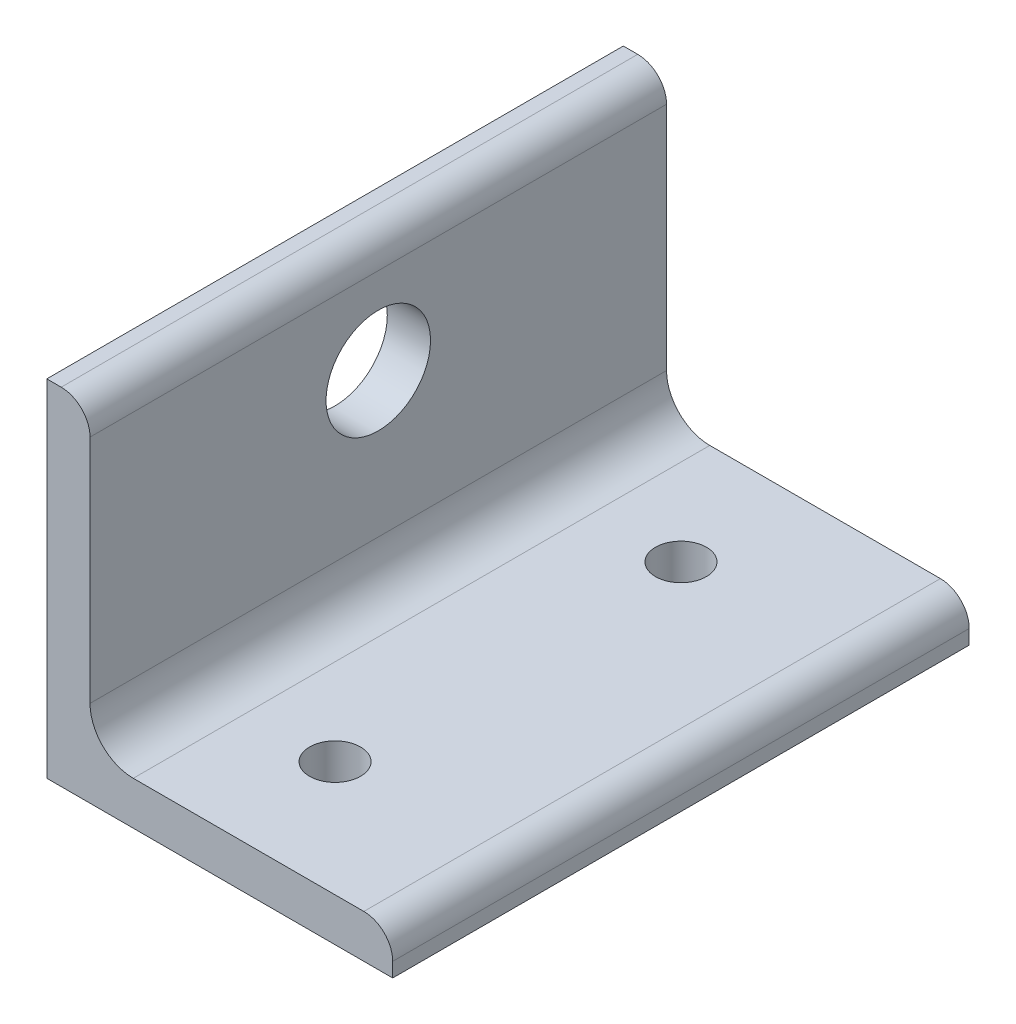
ISO-10303-21;
HEADER;
FILE_DESCRIPTION(('STEP AP214'),'2;1');
FILE_NAME('part.step','',(''),(''),'','','');
FILE_SCHEMA(('AUTOMOTIVE_DESIGN { 1 0 10303 214 1 1 1 1 }'));
ENDSEC;
DATA;
#1=APPLICATION_CONTEXT('core data for automotive mechanical design processes');
#2=APPLICATION_PROTOCOL_DEFINITION('international standard','automotive_design',2000,#1);
#3=PRODUCT_CONTEXT('',#1,'mechanical');
#4=PRODUCT('Part','Part','',(#3));
#5=PRODUCT_RELATED_PRODUCT_CATEGORY('part','',(#4));
#6=PRODUCT_DEFINITION_FORMATION('','',#4);
#7=PRODUCT_DEFINITION_CONTEXT('part definition',#1,'design');
#8=PRODUCT_DEFINITION('design','',#6,#7);
#9=PRODUCT_DEFINITION_SHAPE('','',#8);
#10=(LENGTH_UNIT() NAMED_UNIT(*) SI_UNIT(.MILLI.,.METRE.));
#11=(NAMED_UNIT(*) PLANE_ANGLE_UNIT() SI_UNIT($,.RADIAN.));
#12=(NAMED_UNIT(*) SI_UNIT($,.STERADIAN.) SOLID_ANGLE_UNIT());
#13=UNCERTAINTY_MEASURE_WITH_UNIT(LENGTH_MEASURE(1.E-05),#10,'distance_accuracy_value','');
#14=(GEOMETRIC_REPRESENTATION_CONTEXT(3) GLOBAL_UNCERTAINTY_ASSIGNED_CONTEXT((#13)) GLOBAL_UNIT_ASSIGNED_CONTEXT((#10,
#11,#12)) REPRESENTATION_CONTEXT('',''));
#15=CARTESIAN_POINT('',(0.,0.,0.));
#16=DIRECTION('',(0.,0.,1.));
#17=DIRECTION('',(1.,0.,0.));
#18=AXIS2_PLACEMENT_3D('',#15,#16,#17);
#19=CARTESIAN_POINT('',(0.,0.,63.5));
#20=DIRECTION('',(0.,1.,0.));
#21=DIRECTION('',(0.,0.,1.));
#22=AXIS2_PLACEMENT_3D('',#19,#20,#21);
#23=PLANE('',#22);
#24=CARTESIAN_POINT('',(19.05,0.,50.8));
#25=DIRECTION('',(0.,1.,0.));
#26=DIRECTION('',(0.,0.,1.));
#27=AXIS2_PLACEMENT_3D('',#24,#25,#26);
#28=CIRCLE('',#27,2.80669999999999);
#29=CARTESIAN_POINT('',(19.05,0.,53.6067));
#30=VERTEX_POINT('',#29);
#31=EDGE_CURVE('E197',#30,#30,#28,.T.);
#32=ORIENTED_EDGE('',*,*,#31,.T.);
#33=EDGE_LOOP('',(#32));
#34=FACE_BOUND('',#33,.T.);
#35=CARTESIAN_POINT('',(19.05,0.,12.7));
#36=DIRECTION('',(0.,1.,0.));
#37=DIRECTION('',(0.,0.,1.));
#38=AXIS2_PLACEMENT_3D('',#35,#36,#37);
#39=CIRCLE('',#38,2.80669999999999);
#40=CARTESIAN_POINT('',(19.05,0.,15.5067));
#41=VERTEX_POINT('',#40);
#42=EDGE_CURVE('E138',#41,#41,#39,.T.);
#43=ORIENTED_EDGE('',*,*,#42,.T.);
#44=EDGE_LOOP('',(#43));
#45=FACE_BOUND('',#44,.T.);
#46=DIRECTION('',(1.,0.,0.));
#47=VECTOR('',#46,1.);
#48=CARTESIAN_POINT('',(0.,0.,0.));
#49=LINE('',#48,#47);
#50=CARTESIAN_POINT('',(0.,0.,0.));
#51=VERTEX_POINT('',#50);
#52=CARTESIAN_POINT('',(38.1,0.,0.));
#53=VERTEX_POINT('',#52);
#54=EDGE_CURVE('E134',#51,#53,#49,.T.);
#55=ORIENTED_EDGE('',*,*,#54,.T.);
#56=DIRECTION('',(0.,0.,-1.));
#57=VECTOR('',#56,1.);
#58=CARTESIAN_POINT('',(38.1,0.,63.5));
#59=LINE('',#58,#57);
#60=CARTESIAN_POINT('',(38.1,0.,63.5));
#61=VERTEX_POINT('',#60);
#62=EDGE_CURVE('E11',#61,#53,#59,.T.);
#63=ORIENTED_EDGE('',*,*,#62,.F.);
#64=DIRECTION('',(1.,0.,0.));
#65=VECTOR('',#64,1.);
#66=CARTESIAN_POINT('',(0.,0.,63.5));
#67=LINE('',#66,#65);
#68=CARTESIAN_POINT('',(0.,0.,63.5));
#69=VERTEX_POINT('',#68);
#70=EDGE_CURVE('E151',#69,#61,#67,.T.);
#71=ORIENTED_EDGE('',*,*,#70,.F.);
#72=DIRECTION('',(0.,0.,-1.));
#73=VECTOR('',#72,1.);
#74=CARTESIAN_POINT('',(0.,0.,63.5));
#75=LINE('',#74,#73);
#76=EDGE_CURVE('E130',#69,#51,#75,.T.);
#77=ORIENTED_EDGE('',*,*,#76,.T.);
#78=EDGE_LOOP('',(#55,#63,#71,#77));
#79=FACE_BOUND('',#78,.T.);
#80=ADVANCED_FACE('F32',(#34,#45,#79),#23,.F.);
#81=CARTESIAN_POINT('',(38.1,0.,63.5));
#82=DIRECTION('',(-1.,0.,0.));
#83=DIRECTION('',(0.,0.,1.));
#84=AXIS2_PLACEMENT_3D('',#81,#82,#83);
#85=PLANE('',#84);
#86=DIRECTION('',(0.,1.,0.));
#87=VECTOR('',#86,1.);
#88=CARTESIAN_POINT('',(38.1,0.,0.));
#89=LINE('',#88,#87);
#90=CARTESIAN_POINT('',(38.1,1.5875,0.));
#91=VERTEX_POINT('',#90);
#92=EDGE_CURVE('E137',#53,#91,#89,.T.);
#93=ORIENTED_EDGE('',*,*,#92,.T.);
#94=DIRECTION('',(0.,0.,-1.));
#95=VECTOR('',#94,1.);
#96=CARTESIAN_POINT('',(38.1,1.5875,63.5));
#97=LINE('',#96,#95);
#98=CARTESIAN_POINT('',(38.1,1.5875,63.5));
#99=VERTEX_POINT('',#98);
#100=EDGE_CURVE('E40',#99,#91,#97,.T.);
#101=ORIENTED_EDGE('',*,*,#100,.F.);
#102=DIRECTION('',(0.,1.,0.));
#103=VECTOR('',#102,1.);
#104=CARTESIAN_POINT('',(38.1,0.,63.5));
#105=LINE('',#104,#103);
#106=EDGE_CURVE('E94',#61,#99,#105,.T.);
#107=ORIENTED_EDGE('',*,*,#106,.F.);
#108=ORIENTED_EDGE('',*,*,#62,.T.);
#109=EDGE_LOOP('',(#93,#101,#107,#108));
#110=FACE_BOUND('',#109,.T.);
#111=ADVANCED_FACE('F236',(#110),#85,.F.);
#112=CARTESIAN_POINT('',(34.925,1.5875,63.5));
#113=DIRECTION('',(0.,0.,-1.));
#114=DIRECTION('',(-1.,0.,0.));
#115=AXIS2_PLACEMENT_3D('',#112,#113,#114);
#116=CYLINDRICAL_SURFACE('',#115,3.175);
#117=CARTESIAN_POINT('',(34.925,1.5875,0.));
#118=DIRECTION('',(0.,0.,1.));
#119=DIRECTION('',(1.,0.,0.));
#120=AXIS2_PLACEMENT_3D('',#117,#118,#119);
#121=CIRCLE('',#120,3.175);
#122=CARTESIAN_POINT('',(34.925,4.7625,0.));
#123=VERTEX_POINT('',#122);
#124=EDGE_CURVE('E140',#91,#123,#121,.T.);
#125=ORIENTED_EDGE('',*,*,#124,.T.);
#126=DIRECTION('',(0.,0.,-1.));
#127=VECTOR('',#126,1.);
#128=CARTESIAN_POINT('',(34.925,4.7625,63.5));
#129=LINE('',#128,#127);
#130=CARTESIAN_POINT('',(34.925,4.7625,63.5));
#131=VERTEX_POINT('',#130);
#132=EDGE_CURVE('E161',#131,#123,#129,.T.);
#133=ORIENTED_EDGE('',*,*,#132,.F.);
#134=CARTESIAN_POINT('',(34.925,1.5875,63.5));
#135=DIRECTION('',(0.,0.,1.));
#136=DIRECTION('',(1.,0.,0.));
#137=AXIS2_PLACEMENT_3D('',#134,#135,#136);
#138=CIRCLE('',#137,3.175);
#139=EDGE_CURVE('E169',#99,#131,#138,.T.);
#140=ORIENTED_EDGE('',*,*,#139,.F.);
#141=ORIENTED_EDGE('',*,*,#100,.T.);
#142=EDGE_LOOP('',(#125,#133,#140,#141));
#143=FACE_BOUND('',#142,.T.);
#144=ADVANCED_FACE('F167',(#143),#116,.T.);
#145=CARTESIAN_POINT('',(34.925,4.7625,63.5));
#146=DIRECTION('',(0.,-1.,0.));
#147=DIRECTION('',(1.,0.,0.));
#148=AXIS2_PLACEMENT_3D('',#145,#146,#147);
#149=PLANE('',#148);
#150=CARTESIAN_POINT('',(19.05,4.7625,50.8));
#151=DIRECTION('',(0.,1.,0.));
#152=DIRECTION('',(0.,0.,1.));
#153=AXIS2_PLACEMENT_3D('',#150,#151,#152);
#154=CIRCLE('',#153,2.80669999999999);
#155=CARTESIAN_POINT('',(19.05,4.7625,53.6067));
#156=VERTEX_POINT('',#155);
#157=EDGE_CURVE('E200',#156,#156,#154,.T.);
#158=ORIENTED_EDGE('',*,*,#157,.F.);
#159=EDGE_LOOP('',(#158));
#160=FACE_BOUND('',#159,.T.);
#161=CARTESIAN_POINT('',(19.05,4.7625,12.7));
#162=DIRECTION('',(0.,1.,0.));
#163=DIRECTION('',(0.,0.,1.));
#164=AXIS2_PLACEMENT_3D('',#161,#162,#163);
#165=CIRCLE('',#164,2.80669999999999);
#166=CARTESIAN_POINT('',(19.05,4.7625,15.5067));
#167=VERTEX_POINT('',#166);
#168=EDGE_CURVE('E194',#167,#167,#165,.T.);
#169=ORIENTED_EDGE('',*,*,#168,.F.);
#170=EDGE_LOOP('',(#169));
#171=FACE_BOUND('',#170,.T.);
#172=DIRECTION('',(-1.,0.,0.));
#173=VECTOR('',#172,1.);
#174=CARTESIAN_POINT('',(34.925,4.7625,0.));
#175=LINE('',#174,#173);
#176=CARTESIAN_POINT('',(9.525,4.76249999999999,0.));
#177=VERTEX_POINT('',#176);
#178=EDGE_CURVE('E142',#123,#177,#175,.T.);
#179=ORIENTED_EDGE('',*,*,#178,.T.);
#180=DIRECTION('',(0.,0.,-1.));
#181=VECTOR('',#180,1.);
#182=CARTESIAN_POINT('',(9.525,4.76249999999999,63.5));
#183=LINE('',#182,#181);
#184=CARTESIAN_POINT('',(9.525,4.76249999999999,63.5));
#185=VERTEX_POINT('',#184);
#186=EDGE_CURVE('E158',#185,#177,#183,.T.);
#187=ORIENTED_EDGE('',*,*,#186,.F.);
#188=DIRECTION('',(-1.,0.,0.));
#189=VECTOR('',#188,1.);
#190=CARTESIAN_POINT('',(34.925,4.7625,63.5));
#191=LINE('',#190,#189);
#192=EDGE_CURVE('E185',#131,#185,#191,.T.);
#193=ORIENTED_EDGE('',*,*,#192,.F.);
#194=ORIENTED_EDGE('',*,*,#132,.T.);
#195=EDGE_LOOP('',(#179,#187,#193,#194));
#196=FACE_BOUND('',#195,.T.);
#197=ADVANCED_FACE('F178',(#160,#171,#196),#149,.F.);
#198=CARTESIAN_POINT('',(9.525,9.52499999999999,63.5));
#199=DIRECTION('',(0.,0.,-1.));
#200=DIRECTION('',(-1.,0.,0.));
#201=AXIS2_PLACEMENT_3D('',#198,#199,#200);
#202=CYLINDRICAL_SURFACE('',#201,4.7625);
#203=CARTESIAN_POINT('',(9.525,9.52499999999999,0.));
#204=DIRECTION('',(0.,0.,-1.));
#205=DIRECTION('',(1.,0.,0.));
#206=AXIS2_PLACEMENT_3D('',#203,#204,#205);
#207=CIRCLE('',#206,4.7625);
#208=CARTESIAN_POINT('',(4.7625,9.52499999999999,0.));
#209=VERTEX_POINT('',#208);
#210=EDGE_CURVE('E144',#177,#209,#207,.T.);
#211=ORIENTED_EDGE('',*,*,#210,.T.);
#212=DIRECTION('',(0.,0.,-1.));
#213=VECTOR('',#212,1.);
#214=CARTESIAN_POINT('',(4.7625,9.52499999999999,63.5));
#215=LINE('',#214,#213);
#216=CARTESIAN_POINT('',(4.7625,9.52499999999999,63.5));
#217=VERTEX_POINT('',#216);
#218=EDGE_CURVE('E155',#217,#209,#215,.T.);
#219=ORIENTED_EDGE('',*,*,#218,.F.);
#220=CARTESIAN_POINT('',(9.525,9.52499999999999,63.5));
#221=DIRECTION('',(0.,0.,-1.));
#222=DIRECTION('',(1.,0.,0.));
#223=AXIS2_PLACEMENT_3D('',#220,#221,#222);
#224=CIRCLE('',#223,4.7625);
#225=EDGE_CURVE('E184',#185,#217,#224,.T.);
#226=ORIENTED_EDGE('',*,*,#225,.F.);
#227=ORIENTED_EDGE('',*,*,#186,.T.);
#228=EDGE_LOOP('',(#211,#219,#226,#227));
#229=FACE_BOUND('',#228,.T.);
#230=ADVANCED_FACE('F182',(#229),#202,.F.);
#231=CARTESIAN_POINT('',(4.76249999999999,34.925,63.5));
#232=DIRECTION('',(-1.,0.,0.));
#233=DIRECTION('',(0.,-1.,0.));
#234=AXIS2_PLACEMENT_3D('',#231,#232,#233);
#235=PLANE('',#234);
#236=CARTESIAN_POINT('',(4.7625,25.4,31.75));
#237=DIRECTION('',(1.,0.,0.));
#238=DIRECTION('',(0.,0.,-1.));
#239=AXIS2_PLACEMENT_3D('',#236,#237,#238);
#240=CIRCLE('',#239,5.75437);
#241=CARTESIAN_POINT('',(4.7625,25.4,25.99563));
#242=VERTEX_POINT('',#241);
#243=EDGE_CURVE('E203',#242,#242,#240,.T.);
#244=ORIENTED_EDGE('',*,*,#243,.F.);
#245=EDGE_LOOP('',(#244));
#246=FACE_BOUND('',#245,.T.);
#247=DIRECTION('',(0.,1.,0.));
#248=VECTOR('',#247,1.);
#249=CARTESIAN_POINT('',(4.76249999999999,34.925,0.));
#250=LINE('',#249,#248);
#251=CARTESIAN_POINT('',(4.76249999999999,34.925,0.));
#252=VERTEX_POINT('',#251);
#253=EDGE_CURVE('E146',#209,#252,#250,.T.);
#254=ORIENTED_EDGE('',*,*,#253,.T.);
#255=DIRECTION('',(0.,0.,-1.));
#256=VECTOR('',#255,1.);
#257=CARTESIAN_POINT('',(4.76249999999999,34.925,63.5));
#258=LINE('',#257,#256);
#259=CARTESIAN_POINT('',(4.76249999999999,34.925,63.5));
#260=VERTEX_POINT('',#259);
#261=EDGE_CURVE('E125',#260,#252,#258,.T.);
#262=ORIENTED_EDGE('',*,*,#261,.F.);
#263=DIRECTION('',(0.,1.,0.));
#264=VECTOR('',#263,1.);
#265=CARTESIAN_POINT('',(4.76249999999999,34.925,63.5));
#266=LINE('',#265,#264);
#267=EDGE_CURVE('E116',#217,#260,#266,.T.);
#268=ORIENTED_EDGE('',*,*,#267,.F.);
#269=ORIENTED_EDGE('',*,*,#218,.T.);
#270=EDGE_LOOP('',(#254,#262,#268,#269));
#271=FACE_BOUND('',#270,.T.);
#272=ADVANCED_FACE('F219',(#246,#271),#235,.F.);
#273=CARTESIAN_POINT('',(1.58749999999999,34.925,63.5));
#274=DIRECTION('',(0.,0.,-1.));
#275=DIRECTION('',(-1.,0.,0.));
#276=AXIS2_PLACEMENT_3D('',#273,#274,#275);
#277=CYLINDRICAL_SURFACE('',#276,3.175);
#278=CARTESIAN_POINT('',(1.58749999999999,34.925,0.));
#279=DIRECTION('',(0.,0.,1.));
#280=DIRECTION('',(1.,0.,0.));
#281=AXIS2_PLACEMENT_3D('',#278,#279,#280);
#282=CIRCLE('',#281,3.175);
#283=CARTESIAN_POINT('',(1.58749999999999,38.1,0.));
#284=VERTEX_POINT('',#283);
#285=EDGE_CURVE('E124',#252,#284,#282,.T.);
#286=ORIENTED_EDGE('',*,*,#285,.T.);
#287=DIRECTION('',(0.,0.,-1.));
#288=VECTOR('',#287,1.);
#289=CARTESIAN_POINT('',(1.58749999999999,38.1,63.5));
#290=LINE('',#289,#288);
#291=CARTESIAN_POINT('',(1.58749999999999,38.1,63.5));
#292=VERTEX_POINT('',#291);
#293=EDGE_CURVE('E121',#292,#284,#290,.T.);
#294=ORIENTED_EDGE('',*,*,#293,.F.);
#295=CARTESIAN_POINT('',(1.58749999999999,34.925,63.5));
#296=DIRECTION('',(0.,0.,1.));
#297=DIRECTION('',(1.,0.,0.));
#298=AXIS2_PLACEMENT_3D('',#295,#296,#297);
#299=CIRCLE('',#298,3.175);
#300=EDGE_CURVE('E110',#260,#292,#299,.T.);
#301=ORIENTED_EDGE('',*,*,#300,.F.);
#302=ORIENTED_EDGE('',*,*,#261,.T.);
#303=EDGE_LOOP('',(#286,#294,#301,#302));
#304=FACE_BOUND('',#303,.T.);
#305=ADVANCED_FACE('F122',(#304),#277,.T.);
#306=CARTESIAN_POINT('',(0.,38.1,63.5));
#307=DIRECTION('',(0.,-1.,0.));
#308=DIRECTION('',(0.,0.,-1.));
#309=AXIS2_PLACEMENT_3D('',#306,#307,#308);
#310=PLANE('',#309);
#311=DIRECTION('',(-1.,0.,0.));
#312=VECTOR('',#311,1.);
#313=CARTESIAN_POINT('',(0.,38.1,0.));
#314=LINE('',#313,#312);
#315=CARTESIAN_POINT('',(0.,38.1,0.));
#316=VERTEX_POINT('',#315);
#317=EDGE_CURVE('E80',#284,#316,#314,.T.);
#318=ORIENTED_EDGE('',*,*,#317,.T.);
#319=DIRECTION('',(0.,0.,-1.));
#320=VECTOR('',#319,1.);
#321=CARTESIAN_POINT('',(0.,38.1,63.5));
#322=LINE('',#321,#320);
#323=CARTESIAN_POINT('',(0.,38.1,63.5));
#324=VERTEX_POINT('',#323);
#325=EDGE_CURVE('E126',#324,#316,#322,.T.);
#326=ORIENTED_EDGE('',*,*,#325,.F.);
#327=DIRECTION('',(-1.,0.,0.));
#328=VECTOR('',#327,1.);
#329=CARTESIAN_POINT('',(0.,38.1,63.5));
#330=LINE('',#329,#328);
#331=EDGE_CURVE('E114',#292,#324,#330,.T.);
#332=ORIENTED_EDGE('',*,*,#331,.F.);
#333=ORIENTED_EDGE('',*,*,#293,.T.);
#334=EDGE_LOOP('',(#318,#326,#332,#333));
#335=FACE_BOUND('',#334,.T.);
#336=ADVANCED_FACE('F128',(#335),#310,.F.);
#337=CARTESIAN_POINT('',(0.,0.,63.5));
#338=DIRECTION('',(1.,0.,0.));
#339=DIRECTION('',(0.,1.,0.));
#340=AXIS2_PLACEMENT_3D('',#337,#338,#339);
#341=PLANE('',#340);
#342=CARTESIAN_POINT('',(0.,25.4,31.75));
#343=DIRECTION('',(1.,0.,0.));
#344=DIRECTION('',(0.,0.,-1.));
#345=AXIS2_PLACEMENT_3D('',#342,#343,#344);
#346=CIRCLE('',#345,5.75437);
#347=CARTESIAN_POINT('',(0.,25.4,25.99563));
#348=VERTEX_POINT('',#347);
#349=EDGE_CURVE('E206',#348,#348,#346,.T.);
#350=ORIENTED_EDGE('',*,*,#349,.T.);
#351=EDGE_LOOP('',(#350));
#352=FACE_BOUND('',#351,.T.);
#353=DIRECTION('',(0.,-1.,0.));
#354=VECTOR('',#353,1.);
#355=CARTESIAN_POINT('',(0.,0.,0.));
#356=LINE('',#355,#354);
#357=EDGE_CURVE('E86',#316,#51,#356,.T.);
#358=ORIENTED_EDGE('',*,*,#357,.T.);
#359=ORIENTED_EDGE('',*,*,#76,.F.);
#360=DIRECTION('',(0.,-1.,0.));
#361=VECTOR('',#360,1.);
#362=CARTESIAN_POINT('',(0.,0.,63.5));
#363=LINE('',#362,#361);
#364=EDGE_CURVE('E48',#324,#69,#363,.T.);
#365=ORIENTED_EDGE('',*,*,#364,.F.);
#366=ORIENTED_EDGE('',*,*,#325,.T.);
#367=EDGE_LOOP('',(#358,#359,#365,#366));
#368=FACE_BOUND('',#367,.T.);
#369=ADVANCED_FACE('F210',(#352,#368),#341,.F.);
#370=CARTESIAN_POINT('',(34.925,1.5875,63.5));
#371=DIRECTION('',(0.,0.,1.));
#372=DIRECTION('',(1.,0.,0.));
#373=AXIS2_PLACEMENT_3D('',#370,#371,#372);
#374=PLANE('',#373);
#375=ORIENTED_EDGE('',*,*,#70,.T.);
#376=ORIENTED_EDGE('',*,*,#106,.T.);
#377=ORIENTED_EDGE('',*,*,#139,.T.);
#378=ORIENTED_EDGE('',*,*,#192,.T.);
#379=ORIENTED_EDGE('',*,*,#225,.T.);
#380=ORIENTED_EDGE('',*,*,#267,.T.);
#381=ORIENTED_EDGE('',*,*,#300,.T.);
#382=ORIENTED_EDGE('',*,*,#331,.T.);
#383=ORIENTED_EDGE('',*,*,#364,.T.);
#384=EDGE_LOOP('',(#375,#376,#377,#378,#379,#380,#381,#382,#383));
#385=FACE_BOUND('',#384,.T.);
#386=ADVANCED_FACE('F112',(#385),#374,.T.);
#387=CARTESIAN_POINT('',(34.925,1.5875,0.));
#388=DIRECTION('',(0.,0.,1.));
#389=DIRECTION('',(1.,0.,0.));
#390=AXIS2_PLACEMENT_3D('',#387,#388,#389);
#391=PLANE('',#390);
#392=ORIENTED_EDGE('',*,*,#54,.F.);
#393=ORIENTED_EDGE('',*,*,#357,.F.);
#394=ORIENTED_EDGE('',*,*,#317,.F.);
#395=ORIENTED_EDGE('',*,*,#285,.F.);
#396=ORIENTED_EDGE('',*,*,#253,.F.);
#397=ORIENTED_EDGE('',*,*,#210,.F.);
#398=ORIENTED_EDGE('',*,*,#178,.F.);
#399=ORIENTED_EDGE('',*,*,#124,.F.);
#400=ORIENTED_EDGE('',*,*,#92,.F.);
#401=EDGE_LOOP('',(#392,#393,#394,#395,#396,#397,#398,#399,#400));
#402=FACE_BOUND('',#401,.T.);
#403=ADVANCED_FACE('F173',(#402),#391,.F.);
#404=CARTESIAN_POINT('',(19.05,4.7625,12.7));
#405=DIRECTION('',(0.,1.,0.));
#406=DIRECTION('',(0.,0.,1.));
#407=AXIS2_PLACEMENT_3D('',#404,#405,#406);
#408=CYLINDRICAL_SURFACE('',#407,2.80669999999999);
#409=ORIENTED_EDGE('',*,*,#42,.F.);
#410=EDGE_LOOP('',(#409));
#411=FACE_BOUND('',#410,.T.);
#412=ORIENTED_EDGE('',*,*,#168,.T.);
#413=EDGE_LOOP('',(#412));
#414=FACE_BOUND('',#413,.T.);
#415=ADVANCED_FACE('F245',(#411,#414),#408,.F.);
#416=CARTESIAN_POINT('',(19.05,4.7625,50.8));
#417=DIRECTION('',(0.,1.,0.));
#418=DIRECTION('',(0.,0.,1.));
#419=AXIS2_PLACEMENT_3D('',#416,#417,#418);
#420=CYLINDRICAL_SURFACE('',#419,2.80669999999999);
#421=ORIENTED_EDGE('',*,*,#31,.F.);
#422=EDGE_LOOP('',(#421));
#423=FACE_BOUND('',#422,.T.);
#424=ORIENTED_EDGE('',*,*,#157,.T.);
#425=EDGE_LOOP('',(#424));
#426=FACE_BOUND('',#425,.T.);
#427=ADVANCED_FACE('F215',(#423,#426),#420,.F.);
#428=CARTESIAN_POINT('',(4.7625,25.4,31.75));
#429=DIRECTION('',(1.,0.,0.));
#430=DIRECTION('',(0.,0.,-1.));
#431=AXIS2_PLACEMENT_3D('',#428,#429,#430);
#432=CYLINDRICAL_SURFACE('',#431,5.75437);
#433=ORIENTED_EDGE('',*,*,#349,.F.);
#434=EDGE_LOOP('',(#433));
#435=FACE_BOUND('',#434,.T.);
#436=ORIENTED_EDGE('',*,*,#243,.T.);
#437=EDGE_LOOP('',(#436));
#438=FACE_BOUND('',#437,.T.);
#439=ADVANCED_FACE('F212',(#435,#438),#432,.F.);
#440=CLOSED_SHELL('',(#80,#111,#144,#197,#230,#272,#305,#336,#369,#386,#403,#415,#427,#439));
#441=MANIFOLD_SOLID_BREP('B2',#440);
#442=ADVANCED_BREP_SHAPE_REPRESENTATION('',(#18,#441),#14);
#443=SHAPE_DEFINITION_REPRESENTATION(#9,#442);
ENDSEC;
END-ISO-10303-21;
